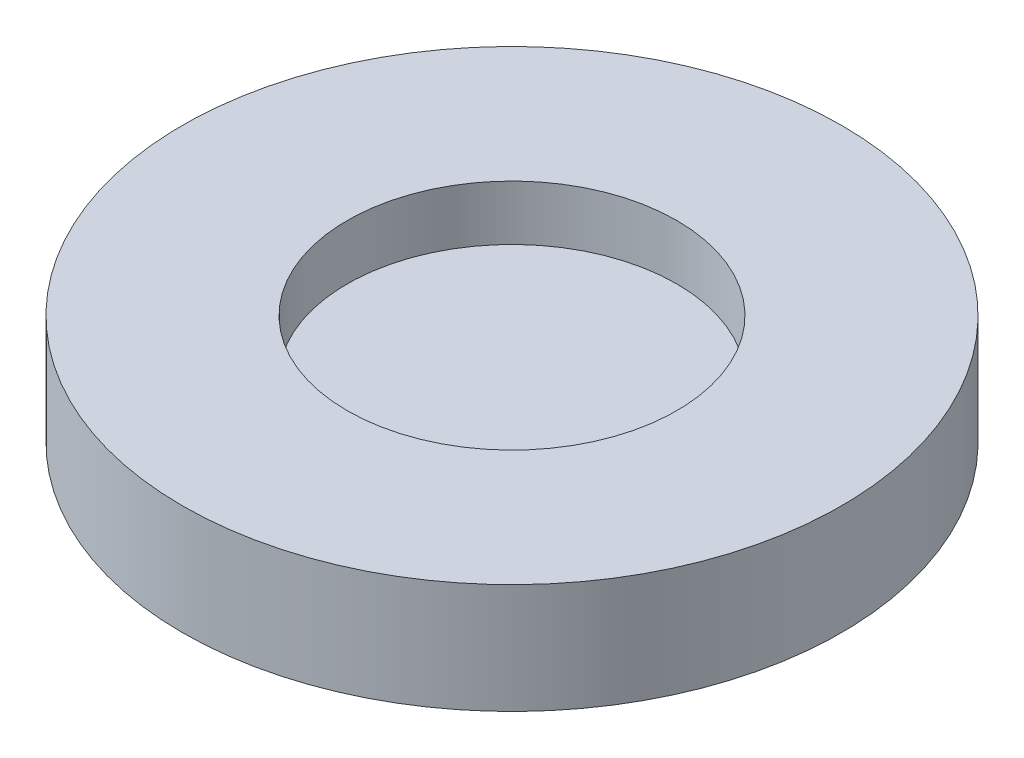
ISO-10303-21;
HEADER;
FILE_DESCRIPTION(('STEP AP214'),'2;1');
FILE_NAME('part.step','',(''),(''),'','','');
FILE_SCHEMA(('AUTOMOTIVE_DESIGN { 1 0 10303 214 1 1 1 1 }'));
ENDSEC;
DATA;
#1=APPLICATION_CONTEXT('core data for automotive mechanical design processes');
#2=APPLICATION_PROTOCOL_DEFINITION('international standard','automotive_design',2000,#1);
#3=PRODUCT_CONTEXT('',#1,'mechanical');
#4=PRODUCT('Part','Part','',(#3));
#5=PRODUCT_RELATED_PRODUCT_CATEGORY('part','',(#4));
#6=PRODUCT_DEFINITION_FORMATION('','',#4);
#7=PRODUCT_DEFINITION_CONTEXT('part definition',#1,'design');
#8=PRODUCT_DEFINITION('design','',#6,#7);
#9=PRODUCT_DEFINITION_SHAPE('','',#8);
#10=(LENGTH_UNIT() NAMED_UNIT(*) SI_UNIT(.MILLI.,.METRE.));
#11=(NAMED_UNIT(*) PLANE_ANGLE_UNIT() SI_UNIT($,.RADIAN.));
#12=(NAMED_UNIT(*) SI_UNIT($,.STERADIAN.) SOLID_ANGLE_UNIT());
#13=UNCERTAINTY_MEASURE_WITH_UNIT(LENGTH_MEASURE(1.E-05),#10,'distance_accuracy_value','');
#14=(GEOMETRIC_REPRESENTATION_CONTEXT(3) GLOBAL_UNCERTAINTY_ASSIGNED_CONTEXT((#13)) GLOBAL_UNIT_ASSIGNED_CONTEXT((#10,
#11,#12)) REPRESENTATION_CONTEXT('',''));
#15=CARTESIAN_POINT('',(0.,0.,0.));
#16=DIRECTION('',(0.,0.,1.));
#17=DIRECTION('',(1.,0.,0.));
#18=AXIS2_PLACEMENT_3D('',#15,#16,#17);
#19=CARTESIAN_POINT('',(0.,25.,0.));
#20=DIRECTION('',(0.,-1.,0.));
#21=DIRECTION('',(0.,0.,-1.));
#22=AXIS2_PLACEMENT_3D('',#19,#20,#21);
#23=CYLINDRICAL_SURFACE('',#22,75.);
#24=CARTESIAN_POINT('',(0.,25.,0.));
#25=DIRECTION('',(0.,1.,0.));
#26=DIRECTION('',(0.,0.,1.));
#27=AXIS2_PLACEMENT_3D('',#24,#25,#26);
#28=CIRCLE('',#27,75.);
#29=CARTESIAN_POINT('',(0.,25.,75.));
#30=VERTEX_POINT('',#29);
#31=EDGE_CURVE('E10',#30,#30,#28,.T.);
#32=ORIENTED_EDGE('',*,*,#31,.F.);
#33=EDGE_LOOP('',(#32));
#34=FACE_BOUND('',#33,.T.);
#35=CARTESIAN_POINT('',(0.,0.,0.));
#36=DIRECTION('',(0.,1.,0.));
#37=DIRECTION('',(0.,0.,1.));
#38=AXIS2_PLACEMENT_3D('',#35,#36,#37);
#39=CIRCLE('',#38,75.);
#40=CARTESIAN_POINT('',(0.,0.,75.));
#41=VERTEX_POINT('',#40);
#42=EDGE_CURVE('E34',#41,#41,#39,.T.);
#43=ORIENTED_EDGE('',*,*,#42,.T.);
#44=EDGE_LOOP('',(#43));
#45=FACE_BOUND('',#44,.T.);
#46=ADVANCED_FACE('F31',(#34,#45),#23,.T.);
#47=CARTESIAN_POINT('',(0.,25.,0.));
#48=DIRECTION('',(0.,1.,0.));
#49=DIRECTION('',(0.,0.,1.));
#50=AXIS2_PLACEMENT_3D('',#47,#48,#49);
#51=PLANE('',#50);
#52=CARTESIAN_POINT('',(0.,25.,0.));
#53=DIRECTION('',(0.,1.,0.));
#54=DIRECTION('',(0.,0.,1.));
#55=AXIS2_PLACEMENT_3D('',#52,#53,#54);
#56=CIRCLE('',#55,37.5);
#57=CARTESIAN_POINT('',(0.,25.,37.5));
#58=VERTEX_POINT('',#57);
#59=EDGE_CURVE('E43',#58,#58,#56,.T.);
#60=ORIENTED_EDGE('',*,*,#59,.F.);
#61=EDGE_LOOP('',(#60));
#62=FACE_BOUND('',#61,.T.);
#63=ORIENTED_EDGE('',*,*,#31,.T.);
#64=EDGE_LOOP('',(#63));
#65=FACE_BOUND('',#64,.T.);
#66=ADVANCED_FACE('F58',(#62,#65),#51,.T.);
#67=CARTESIAN_POINT('',(0.,0.,0.));
#68=DIRECTION('',(0.,1.,0.));
#69=DIRECTION('',(0.,0.,1.));
#70=AXIS2_PLACEMENT_3D('',#67,#68,#69);
#71=PLANE('',#70);
#72=ORIENTED_EDGE('',*,*,#42,.F.);
#73=EDGE_LOOP('',(#72));
#74=FACE_BOUND('',#73,.T.);
#75=ADVANCED_FACE('F54',(#74),#71,.F.);
#76=CARTESIAN_POINT('',(0.,12.5,0.));
#77=DIRECTION('',(0.,1.,0.));
#78=DIRECTION('',(0.,0.,1.));
#79=AXIS2_PLACEMENT_3D('',#76,#77,#78);
#80=CYLINDRICAL_SURFACE('',#79,37.5);
#81=CARTESIAN_POINT('',(0.,12.5,0.));
#82=DIRECTION('',(0.,1.,0.));
#83=DIRECTION('',(0.,0.,1.));
#84=AXIS2_PLACEMENT_3D('',#81,#82,#83);
#85=CIRCLE('',#84,37.5);
#86=CARTESIAN_POINT('',(0.,12.5,37.5));
#87=VERTEX_POINT('',#86);
#88=EDGE_CURVE('E41',#87,#87,#85,.T.);
#89=ORIENTED_EDGE('',*,*,#88,.F.);
#90=EDGE_LOOP('',(#89));
#91=FACE_BOUND('',#90,.T.);
#92=ORIENTED_EDGE('',*,*,#59,.T.);
#93=EDGE_LOOP('',(#92));
#94=FACE_BOUND('',#93,.T.);
#95=ADVANCED_FACE('F51',(#91,#94),#80,.F.);
#96=CARTESIAN_POINT('',(0.,12.5,0.));
#97=DIRECTION('',(0.,1.,0.));
#98=DIRECTION('',(0.,0.,1.));
#99=AXIS2_PLACEMENT_3D('',#96,#97,#98);
#100=PLANE('',#99);
#101=ORIENTED_EDGE('',*,*,#88,.T.);
#102=EDGE_LOOP('',(#101));
#103=FACE_BOUND('',#102,.T.);
#104=ADVANCED_FACE('F49',(#103),#100,.T.);
#105=CLOSED_SHELL('',(#46,#66,#75,#95,#104));
#106=MANIFOLD_SOLID_BREP('B2',#105);
#107=ADVANCED_BREP_SHAPE_REPRESENTATION('',(#18,#106),#14);
#108=SHAPE_DEFINITION_REPRESENTATION(#9,#107);
ENDSEC;
END-ISO-10303-21;
